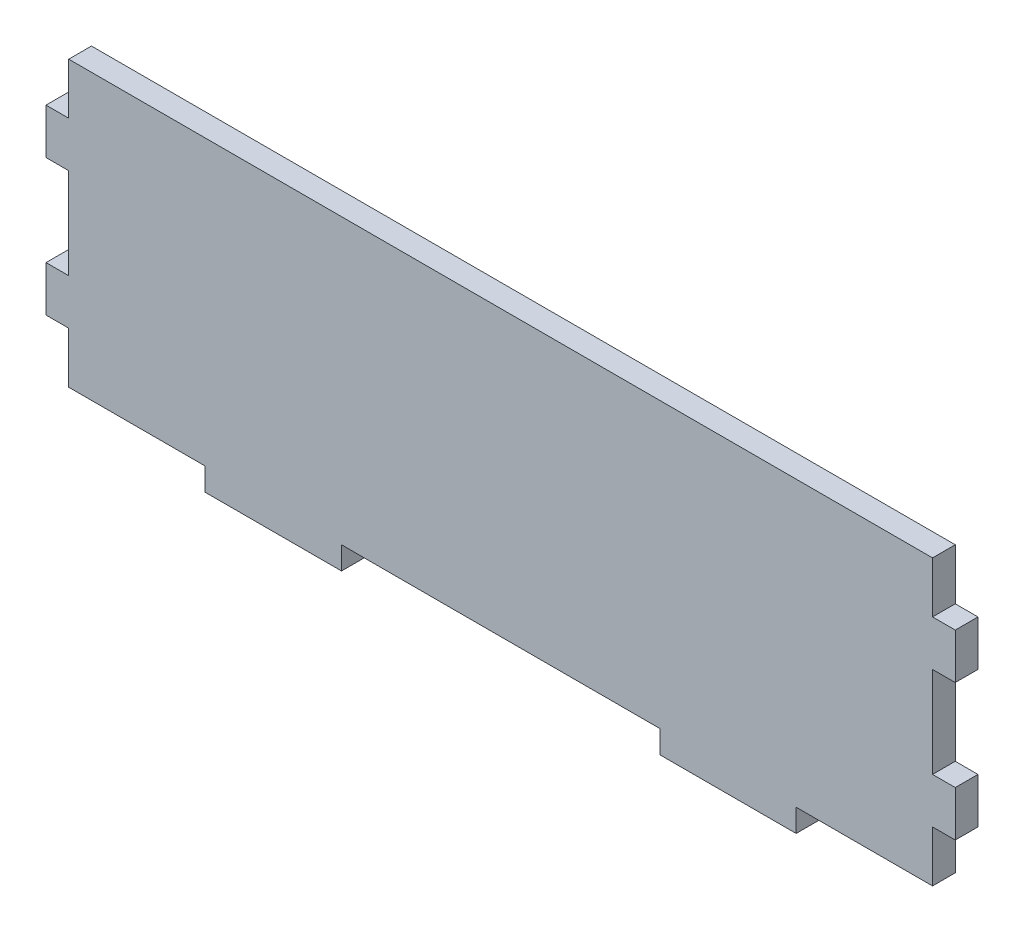
ISO-10303-21;
HEADER;
FILE_DESCRIPTION(('STEP AP214'),'2;1');
FILE_NAME('part.step','',(''),(''),'','','');
FILE_SCHEMA(('AUTOMOTIVE_DESIGN { 1 0 10303 214 1 1 1 1 }'));
ENDSEC;
DATA;
#1=APPLICATION_CONTEXT('core data for automotive mechanical design processes');
#2=APPLICATION_PROTOCOL_DEFINITION('international standard','automotive_design',2000,#1);
#3=PRODUCT_CONTEXT('',#1,'mechanical');
#4=PRODUCT('Part','Part','',(#3));
#5=PRODUCT_RELATED_PRODUCT_CATEGORY('part','',(#4));
#6=PRODUCT_DEFINITION_FORMATION('','',#4);
#7=PRODUCT_DEFINITION_CONTEXT('part definition',#1,'design');
#8=PRODUCT_DEFINITION('design','',#6,#7);
#9=PRODUCT_DEFINITION_SHAPE('','',#8);
#10=(LENGTH_UNIT() NAMED_UNIT(*) SI_UNIT(.MILLI.,.METRE.));
#11=(NAMED_UNIT(*) PLANE_ANGLE_UNIT() SI_UNIT($,.RADIAN.));
#12=(NAMED_UNIT(*) SI_UNIT($,.STERADIAN.) SOLID_ANGLE_UNIT());
#13=UNCERTAINTY_MEASURE_WITH_UNIT(LENGTH_MEASURE(1.E-05),#10,'distance_accuracy_value','');
#14=(GEOMETRIC_REPRESENTATION_CONTEXT(3) GLOBAL_UNCERTAINTY_ASSIGNED_CONTEXT((#13)) GLOBAL_UNIT_ASSIGNED_CONTEXT((#10,
#11,#12)) REPRESENTATION_CONTEXT('',''));
#15=CARTESIAN_POINT('',(0.,0.,0.));
#16=DIRECTION('',(0.,0.,1.));
#17=DIRECTION('',(1.,0.,0.));
#18=AXIS2_PLACEMENT_3D('',#15,#16,#17);
#19=CARTESIAN_POINT('',(96.52,-63.5,-5.08));
#20=DIRECTION('',(0.,-1.,0.));
#21=DIRECTION('',(0.,0.,-1.));
#22=AXIS2_PLACEMENT_3D('',#19,#20,#21);
#23=PLANE('',#22);
#24=DIRECTION('',(1.,0.,0.));
#25=VECTOR('',#24,1.);
#26=CARTESIAN_POINT('',(96.52,-63.5,0.));
#27=LINE('',#26,#25);
#28=CARTESIAN_POINT('',(-35.5600000000001,-63.5,0.));
#29=VERTEX_POINT('',#28);
#30=CARTESIAN_POINT('',(35.56,-63.5,0.));
#31=VERTEX_POINT('',#30);
#32=EDGE_CURVE('E401',#29,#31,#27,.T.);
#33=ORIENTED_EDGE('',*,*,#32,.F.);
#34=DIRECTION('',(0.,0.,1.));
#35=VECTOR('',#34,1.);
#36=CARTESIAN_POINT('',(-35.5600000000001,-63.5,-5.08));
#37=LINE('',#36,#35);
#38=CARTESIAN_POINT('',(-35.5600000000001,-63.5,-5.08));
#39=VERTEX_POINT('',#38);
#40=EDGE_CURVE('E50',#39,#29,#37,.T.);
#41=ORIENTED_EDGE('',*,*,#40,.F.);
#42=DIRECTION('',(1.,0.,0.));
#43=VECTOR('',#42,1.);
#44=CARTESIAN_POINT('',(96.52,-63.5,-5.08));
#45=LINE('',#44,#43);
#46=CARTESIAN_POINT('',(35.56,-63.5,-5.08));
#47=VERTEX_POINT('',#46);
#48=EDGE_CURVE('E387',#39,#47,#45,.T.);
#49=ORIENTED_EDGE('',*,*,#48,.T.);
#50=DIRECTION('',(0.,0.,-1.));
#51=VECTOR('',#50,1.);
#52=CARTESIAN_POINT('',(35.56,-63.5,0.));
#53=LINE('',#52,#51);
#54=EDGE_CURVE('E241',#31,#47,#53,.T.);
#55=ORIENTED_EDGE('',*,*,#54,.F.);
#56=EDGE_LOOP('',(#33,#41,#49,#55));
#57=FACE_BOUND('',#56,.T.);
#58=ADVANCED_FACE('F33',(#57),#23,.T.);
#59=CARTESIAN_POINT('',(-96.5200000000001,-63.5,-5.08));
#60=VERTEX_POINT('',#59);
#61=CARTESIAN_POINT('',(-66.0400000000001,-63.5,-5.08));
#62=VERTEX_POINT('',#61);
#63=EDGE_CURVE('E384',#60,#62,#45,.T.);
#64=ORIENTED_EDGE('',*,*,#63,.T.);
#65=DIRECTION('',(0.,0.,-1.));
#66=VECTOR('',#65,1.);
#67=CARTESIAN_POINT('',(-66.0400000000001,-63.5,-5.08));
#68=LINE('',#67,#66);
#69=CARTESIAN_POINT('',(-66.0400000000001,-63.5,0.));
#70=VERTEX_POINT('',#69);
#71=EDGE_CURVE('E238',#70,#62,#68,.T.);
#72=ORIENTED_EDGE('',*,*,#71,.F.);
#73=CARTESIAN_POINT('',(-96.5200000000001,-63.5,0.));
#74=VERTEX_POINT('',#73);
#75=EDGE_CURVE('E400',#74,#70,#27,.T.);
#76=ORIENTED_EDGE('',*,*,#75,.F.);
#77=DIRECTION('',(0.,0.,1.));
#78=VECTOR('',#77,1.);
#79=CARTESIAN_POINT('',(-96.5200000000001,-63.5,-5.08));
#80=LINE('',#79,#78);
#81=EDGE_CURVE('E42',#60,#74,#80,.T.);
#82=ORIENTED_EDGE('',*,*,#81,.F.);
#83=EDGE_LOOP('',(#64,#72,#76,#82));
#84=FACE_BOUND('',#83,.T.);
#85=ADVANCED_FACE('F474',(#84),#23,.T.);
#86=CARTESIAN_POINT('',(-96.5200000000001,-63.5,-5.08));
#87=DIRECTION('',(-1.,0.,0.));
#88=DIRECTION('',(0.,0.,1.));
#89=AXIS2_PLACEMENT_3D('',#86,#87,#88);
#90=PLANE('',#89);
#91=DIRECTION('',(0.,-1.,0.));
#92=VECTOR('',#91,1.);
#93=CARTESIAN_POINT('',(-96.5200000000001,-63.5,0.));
#94=LINE('',#93,#92);
#95=CARTESIAN_POINT('',(-96.5200000000001,-21.59,0.));
#96=VERTEX_POINT('',#95);
#97=CARTESIAN_POINT('',(-96.5200000000001,-41.91,0.));
#98=VERTEX_POINT('',#97);
#99=EDGE_CURVE('E399',#96,#98,#94,.T.);
#100=ORIENTED_EDGE('',*,*,#99,.F.);
#101=DIRECTION('',(0.,0.,1.));
#102=VECTOR('',#101,1.);
#103=CARTESIAN_POINT('',(-96.5200000000001,-21.59,-5.08));
#104=LINE('',#103,#102);
#105=CARTESIAN_POINT('',(-96.5200000000001,-21.59,-5.08));
#106=VERTEX_POINT('',#105);
#107=EDGE_CURVE('E278',#106,#96,#104,.T.);
#108=ORIENTED_EDGE('',*,*,#107,.F.);
#109=DIRECTION('',(0.,-1.,0.));
#110=VECTOR('',#109,1.);
#111=CARTESIAN_POINT('',(-96.5200000000001,-63.5,-5.08));
#112=LINE('',#111,#110);
#113=CARTESIAN_POINT('',(-96.5200000000001,-41.91,-5.08));
#114=VERTEX_POINT('',#113);
#115=EDGE_CURVE('E383',#106,#114,#112,.T.);
#116=ORIENTED_EDGE('',*,*,#115,.T.);
#117=DIRECTION('',(0.,0.,1.));
#118=VECTOR('',#117,1.);
#119=CARTESIAN_POINT('',(-96.5200000000001,-41.91,-5.08));
#120=LINE('',#119,#118);
#121=EDGE_CURVE('E292',#114,#98,#120,.T.);
#122=ORIENTED_EDGE('',*,*,#121,.T.);
#123=EDGE_LOOP('',(#100,#108,#116,#122));
#124=FACE_BOUND('',#123,.T.);
#125=ADVANCED_FACE('F459',(#124),#90,.T.);
#126=DIRECTION('',(0.,0.,1.));
#127=VECTOR('',#126,1.);
#128=CARTESIAN_POINT('',(-96.5200000000001,-11.43,-5.08));
#129=LINE('',#128,#127);
#130=CARTESIAN_POINT('',(-96.5200000000001,-11.43,-5.08));
#131=VERTEX_POINT('',#130);
#132=CARTESIAN_POINT('',(-96.5200000000001,-11.43,0.));
#133=VERTEX_POINT('',#132);
#134=EDGE_CURVE('E271',#131,#133,#129,.T.);
#135=ORIENTED_EDGE('',*,*,#134,.T.);
#136=CARTESIAN_POINT('',(-96.5200000000001,0.,0.));
#137=VERTEX_POINT('',#136);
#138=EDGE_CURVE('E395',#137,#133,#94,.T.);
#139=ORIENTED_EDGE('',*,*,#138,.F.);
#140=DIRECTION('',(0.,0.,1.));
#141=VECTOR('',#140,1.);
#142=CARTESIAN_POINT('',(-96.5200000000001,0.,-5.08));
#143=LINE('',#142,#141);
#144=CARTESIAN_POINT('',(-96.5200000000001,0.,-5.08));
#145=VERTEX_POINT('',#144);
#146=EDGE_CURVE('E404',#145,#137,#143,.T.);
#147=ORIENTED_EDGE('',*,*,#146,.F.);
#148=EDGE_CURVE('E379',#145,#131,#112,.T.);
#149=ORIENTED_EDGE('',*,*,#148,.T.);
#150=EDGE_LOOP('',(#135,#139,#147,#149));
#151=FACE_BOUND('',#150,.T.);
#152=ADVANCED_FACE('F444',(#151),#90,.T.);
#153=CARTESIAN_POINT('',(96.52,-63.5,-5.08));
#154=DIRECTION('',(1.,0.,0.));
#155=DIRECTION('',(0.,0.,-1.));
#156=AXIS2_PLACEMENT_3D('',#153,#154,#155);
#157=PLANE('',#156);
#158=DIRECTION('',(0.,1.,0.));
#159=VECTOR('',#158,1.);
#160=CARTESIAN_POINT('',(96.52,-63.5,-5.08));
#161=LINE('',#160,#159);
#162=CARTESIAN_POINT('',(96.52,-41.91,-5.08));
#163=VERTEX_POINT('',#162);
#164=CARTESIAN_POINT('',(96.52,-21.59,-5.08));
#165=VERTEX_POINT('',#164);
#166=EDGE_CURVE('E374',#163,#165,#161,.T.);
#167=ORIENTED_EDGE('',*,*,#166,.T.);
#168=DIRECTION('',(0.,0.,1.));
#169=VECTOR('',#168,1.);
#170=CARTESIAN_POINT('',(96.52,-21.59,-5.08));
#171=LINE('',#170,#169);
#172=CARTESIAN_POINT('',(96.52,-21.59,0.));
#173=VERTEX_POINT('',#172);
#174=EDGE_CURVE('E317',#165,#173,#171,.T.);
#175=ORIENTED_EDGE('',*,*,#174,.T.);
#176=DIRECTION('',(0.,1.,0.));
#177=VECTOR('',#176,1.);
#178=CARTESIAN_POINT('',(96.52,-63.5,0.));
#179=LINE('',#178,#177);
#180=CARTESIAN_POINT('',(96.52,-41.91,0.));
#181=VERTEX_POINT('',#180);
#182=EDGE_CURVE('E391',#181,#173,#179,.T.);
#183=ORIENTED_EDGE('',*,*,#182,.F.);
#184=DIRECTION('',(0.,0.,1.));
#185=VECTOR('',#184,1.);
#186=CARTESIAN_POINT('',(96.52,-41.91,-5.08));
#187=LINE('',#186,#185);
#188=EDGE_CURVE('E354',#163,#181,#187,.T.);
#189=ORIENTED_EDGE('',*,*,#188,.F.);
#190=EDGE_LOOP('',(#167,#175,#183,#189));
#191=FACE_BOUND('',#190,.T.);
#192=ADVANCED_FACE('F425',(#191),#157,.T.);
#193=CARTESIAN_POINT('',(96.52,-63.5,-5.08));
#194=VERTEX_POINT('',#193);
#195=CARTESIAN_POINT('',(96.52,-52.07,-5.08));
#196=VERTEX_POINT('',#195);
#197=EDGE_CURVE('E370',#194,#196,#161,.T.);
#198=ORIENTED_EDGE('',*,*,#197,.T.);
#199=DIRECTION('',(0.,0.,1.));
#200=VECTOR('',#199,1.);
#201=CARTESIAN_POINT('',(96.52,-52.07,-5.08));
#202=LINE('',#201,#200);
#203=CARTESIAN_POINT('',(96.52,-52.07,0.));
#204=VERTEX_POINT('',#203);
#205=EDGE_CURVE('E366',#196,#204,#202,.T.);
#206=ORIENTED_EDGE('',*,*,#205,.T.);
#207=CARTESIAN_POINT('',(96.52,-63.5,0.));
#208=VERTEX_POINT('',#207);
#209=EDGE_CURVE('E388',#208,#204,#179,.T.);
#210=ORIENTED_EDGE('',*,*,#209,.F.);
#211=DIRECTION('',(0.,0.,1.));
#212=VECTOR('',#211,1.);
#213=CARTESIAN_POINT('',(96.52,-63.5,-5.08));
#214=LINE('',#213,#212);
#215=EDGE_CURVE('E11',#194,#208,#214,.T.);
#216=ORIENTED_EDGE('',*,*,#215,.F.);
#217=EDGE_LOOP('',(#198,#206,#210,#216));
#218=FACE_BOUND('',#217,.T.);
#219=ADVANCED_FACE('F510',(#218),#157,.T.);
#220=DIRECTION('',(0.,0.,1.));
#221=VECTOR('',#220,1.);
#222=CARTESIAN_POINT('',(96.52,-11.43,-5.08));
#223=LINE('',#222,#221);
#224=CARTESIAN_POINT('',(96.52,-11.43,-5.08));
#225=VERTEX_POINT('',#224);
#226=CARTESIAN_POINT('',(96.52,-11.43,0.));
#227=VERTEX_POINT('',#226);
#228=EDGE_CURVE('E325',#225,#227,#223,.T.);
#229=ORIENTED_EDGE('',*,*,#228,.F.);
#230=CARTESIAN_POINT('',(96.52,0.,-5.08));
#231=VERTEX_POINT('',#230);
#232=EDGE_CURVE('E375',#225,#231,#161,.T.);
#233=ORIENTED_EDGE('',*,*,#232,.T.);
#234=DIRECTION('',(0.,0.,1.));
#235=VECTOR('',#234,1.);
#236=CARTESIAN_POINT('',(96.52,0.,-5.08));
#237=LINE('',#236,#235);
#238=CARTESIAN_POINT('',(96.52,0.,0.));
#239=VERTEX_POINT('',#238);
#240=EDGE_CURVE('E37',#231,#239,#237,.T.);
#241=ORIENTED_EDGE('',*,*,#240,.T.);
#242=EDGE_CURVE('E363',#227,#239,#179,.T.);
#243=ORIENTED_EDGE('',*,*,#242,.F.);
#244=EDGE_LOOP('',(#229,#233,#241,#243));
#245=FACE_BOUND('',#244,.T.);
#246=ADVANCED_FACE('F35',(#245),#157,.T.);
#247=DIRECTION('',(0.,0.,1.));
#248=VECTOR('',#247,1.);
#249=CARTESIAN_POINT('',(66.04,-63.5,0.));
#250=LINE('',#249,#248);
#251=CARTESIAN_POINT('',(66.04,-63.5,-5.08));
#252=VERTEX_POINT('',#251);
#253=CARTESIAN_POINT('',(66.04,-63.5,0.));
#254=VERTEX_POINT('',#253);
#255=EDGE_CURVE('E58',#252,#254,#250,.T.);
#256=ORIENTED_EDGE('',*,*,#255,.F.);
#257=EDGE_CURVE('E382',#252,#194,#45,.T.);
#258=ORIENTED_EDGE('',*,*,#257,.T.);
#259=ORIENTED_EDGE('',*,*,#215,.T.);
#260=EDGE_CURVE('E398',#254,#208,#27,.T.);
#261=ORIENTED_EDGE('',*,*,#260,.F.);
#262=EDGE_LOOP('',(#256,#258,#259,#261));
#263=FACE_BOUND('',#262,.T.);
#264=ADVANCED_FACE('F497',(#263),#23,.T.);
#265=DIRECTION('',(0.,0.,1.));
#266=VECTOR('',#265,1.);
#267=CARTESIAN_POINT('',(-96.5200000000001,-52.07,-5.08));
#268=LINE('',#267,#266);
#269=CARTESIAN_POINT('',(-96.5200000000001,-52.07,-5.08));
#270=VERTEX_POINT('',#269);
#271=CARTESIAN_POINT('',(-96.5200000000001,-52.07,0.));
#272=VERTEX_POINT('',#271);
#273=EDGE_CURVE('E304',#270,#272,#268,.T.);
#274=ORIENTED_EDGE('',*,*,#273,.F.);
#275=EDGE_CURVE('E378',#270,#60,#112,.T.);
#276=ORIENTED_EDGE('',*,*,#275,.T.);
#277=ORIENTED_EDGE('',*,*,#81,.T.);
#278=EDGE_CURVE('E394',#272,#74,#94,.T.);
#279=ORIENTED_EDGE('',*,*,#278,.F.);
#280=EDGE_LOOP('',(#274,#276,#277,#279));
#281=FACE_BOUND('',#280,.T.);
#282=ADVANCED_FACE('F469',(#281),#90,.T.);
#283=CARTESIAN_POINT('',(96.52,0.,-5.08));
#284=DIRECTION('',(0.,1.,0.));
#285=DIRECTION('',(0.,0.,1.));
#286=AXIS2_PLACEMENT_3D('',#283,#284,#285);
#287=PLANE('',#286);
#288=DIRECTION('',(-1.,0.,0.));
#289=VECTOR('',#288,1.);
#290=CARTESIAN_POINT('',(96.52,0.,0.));
#291=LINE('',#290,#289);
#292=EDGE_CURVE('E390',#239,#137,#291,.T.);
#293=ORIENTED_EDGE('',*,*,#292,.F.);
#294=ORIENTED_EDGE('',*,*,#240,.F.);
#295=DIRECTION('',(-1.,0.,0.));
#296=VECTOR('',#295,1.);
#297=CARTESIAN_POINT('',(96.52,0.,-5.08));
#298=LINE('',#297,#296);
#299=EDGE_CURVE('E373',#231,#145,#298,.T.);
#300=ORIENTED_EDGE('',*,*,#299,.T.);
#301=ORIENTED_EDGE('',*,*,#146,.T.);
#302=EDGE_LOOP('',(#293,#294,#300,#301));
#303=FACE_BOUND('',#302,.T.);
#304=ADVANCED_FACE('F415',(#303),#287,.T.);
#305=CARTESIAN_POINT('',(0.,0.,-5.08));
#306=DIRECTION('',(0.,0.,1.));
#307=DIRECTION('',(1.,0.,0.));
#308=AXIS2_PLACEMENT_3D('',#305,#306,#307);
#309=PLANE('',#308);
#310=ORIENTED_EDGE('',*,*,#197,.F.);
#311=ORIENTED_EDGE('',*,*,#257,.F.);
#312=DIRECTION('',(0.,1.,0.));
#313=VECTOR('',#312,1.);
#314=CARTESIAN_POINT('',(66.04,-68.58,-5.08));
#315=LINE('',#314,#313);
#316=CARTESIAN_POINT('',(66.04,-68.58,-5.08));
#317=VERTEX_POINT('',#316);
#318=EDGE_CURVE('E265',#317,#252,#315,.T.);
#319=ORIENTED_EDGE('',*,*,#318,.F.);
#320=DIRECTION('',(1.,0.,0.));
#321=VECTOR('',#320,1.);
#322=CARTESIAN_POINT('',(35.56,-68.58,-5.08));
#323=LINE('',#322,#321);
#324=CARTESIAN_POINT('',(35.56,-68.58,-5.08));
#325=VERTEX_POINT('',#324);
#326=EDGE_CURVE('E252',#325,#317,#323,.T.);
#327=ORIENTED_EDGE('',*,*,#326,.F.);
#328=DIRECTION('',(0.,1.,0.));
#329=VECTOR('',#328,1.);
#330=CARTESIAN_POINT('',(35.56,-68.58,-5.08));
#331=LINE('',#330,#329);
#332=EDGE_CURVE('E268',#325,#47,#331,.T.);
#333=ORIENTED_EDGE('',*,*,#332,.T.);
#334=ORIENTED_EDGE('',*,*,#48,.F.);
#335=DIRECTION('',(0.,1.,0.));
#336=VECTOR('',#335,1.);
#337=CARTESIAN_POINT('',(-35.5600000000001,-68.58,-5.08));
#338=LINE('',#337,#336);
#339=CARTESIAN_POINT('',(-35.5600000000001,-68.58,-5.08));
#340=VERTEX_POINT('',#339);
#341=EDGE_CURVE('E482',#340,#39,#338,.T.);
#342=ORIENTED_EDGE('',*,*,#341,.F.);
#343=DIRECTION('',(1.,0.,0.));
#344=VECTOR('',#343,1.);
#345=CARTESIAN_POINT('',(-35.5600000000001,-68.58,-5.08));
#346=LINE('',#345,#344);
#347=CARTESIAN_POINT('',(-66.0400000000001,-68.58,-5.08));
#348=VERTEX_POINT('',#347);
#349=EDGE_CURVE('E236',#348,#340,#346,.T.);
#350=ORIENTED_EDGE('',*,*,#349,.F.);
#351=DIRECTION('',(0.,1.,0.));
#352=VECTOR('',#351,1.);
#353=CARTESIAN_POINT('',(-66.0400000000001,-68.58,-5.08));
#354=LINE('',#353,#352);
#355=EDGE_CURVE('E245',#348,#62,#354,.T.);
#356=ORIENTED_EDGE('',*,*,#355,.T.);
#357=ORIENTED_EDGE('',*,*,#63,.F.);
#358=ORIENTED_EDGE('',*,*,#275,.F.);
#359=DIRECTION('',(-1.,0.,0.));
#360=VECTOR('',#359,1.);
#361=CARTESIAN_POINT('',(-96.5200000000001,-52.07,-5.08));
#362=LINE('',#361,#360);
#363=CARTESIAN_POINT('',(-101.6,-52.07,-5.08));
#364=VERTEX_POINT('',#363);
#365=EDGE_CURVE('E300',#270,#364,#362,.T.);
#366=ORIENTED_EDGE('',*,*,#365,.T.);
#367=DIRECTION('',(0.,1.,0.));
#368=VECTOR('',#367,1.);
#369=CARTESIAN_POINT('',(-101.6,-52.07,-5.08));
#370=LINE('',#369,#368);
#371=CARTESIAN_POINT('',(-101.6,-41.91,-5.08));
#372=VERTEX_POINT('',#371);
#373=EDGE_CURVE('E319',#364,#372,#370,.T.);
#374=ORIENTED_EDGE('',*,*,#373,.T.);
#375=DIRECTION('',(-1.,0.,0.));
#376=VECTOR('',#375,1.);
#377=CARTESIAN_POINT('',(-96.5200000000001,-41.91,-5.08));
#378=LINE('',#377,#376);
#379=EDGE_CURVE('E311',#114,#372,#378,.T.);
#380=ORIENTED_EDGE('',*,*,#379,.F.);
#381=ORIENTED_EDGE('',*,*,#115,.F.);
#382=DIRECTION('',(-1.,0.,0.));
#383=VECTOR('',#382,1.);
#384=CARTESIAN_POINT('',(-96.5200000000001,-21.59,-5.08));
#385=LINE('',#384,#383);
#386=CARTESIAN_POINT('',(-101.6,-21.59,-5.08));
#387=VERTEX_POINT('',#386);
#388=EDGE_CURVE('E274',#106,#387,#385,.T.);
#389=ORIENTED_EDGE('',*,*,#388,.T.);
#390=DIRECTION('',(0.,1.,0.));
#391=VECTOR('',#390,1.);
#392=CARTESIAN_POINT('',(-101.6,-21.59,-5.08));
#393=LINE('',#392,#391);
#394=CARTESIAN_POINT('',(-101.6,-11.43,-5.08));
#395=VERTEX_POINT('',#394);
#396=EDGE_CURVE('E294',#387,#395,#393,.T.);
#397=ORIENTED_EDGE('',*,*,#396,.T.);
#398=DIRECTION('',(-1.,0.,0.));
#399=VECTOR('',#398,1.);
#400=CARTESIAN_POINT('',(-96.5200000000001,-11.43,-5.08));
#401=LINE('',#400,#399);
#402=EDGE_CURVE('E286',#131,#395,#401,.T.);
#403=ORIENTED_EDGE('',*,*,#402,.F.);
#404=ORIENTED_EDGE('',*,*,#148,.F.);
#405=ORIENTED_EDGE('',*,*,#299,.F.);
#406=ORIENTED_EDGE('',*,*,#232,.F.);
#407=DIRECTION('',(-1.,0.,0.));
#408=VECTOR('',#407,1.);
#409=CARTESIAN_POINT('',(101.6,-11.43,-5.08));
#410=LINE('',#409,#408);
#411=CARTESIAN_POINT('',(101.6,-11.43,-5.08));
#412=VERTEX_POINT('',#411);
#413=EDGE_CURVE('E343',#412,#225,#410,.T.);
#414=ORIENTED_EDGE('',*,*,#413,.F.);
#415=DIRECTION('',(0.,-1.,0.));
#416=VECTOR('',#415,1.);
#417=CARTESIAN_POINT('',(101.6,-11.43,-5.08));
#418=LINE('',#417,#416);
#419=CARTESIAN_POINT('',(101.6,-21.59,-5.08));
#420=VERTEX_POINT('',#419);
#421=EDGE_CURVE('E333',#412,#420,#418,.T.);
#422=ORIENTED_EDGE('',*,*,#421,.T.);
#423=DIRECTION('',(-1.,0.,0.));
#424=VECTOR('',#423,1.);
#425=CARTESIAN_POINT('',(101.6,-21.59,-5.08));
#426=LINE('',#425,#424);
#427=EDGE_CURVE('E337',#420,#165,#426,.T.);
#428=ORIENTED_EDGE('',*,*,#427,.T.);
#429=ORIENTED_EDGE('',*,*,#166,.F.);
#430=DIRECTION('',(-1.,0.,0.));
#431=VECTOR('',#430,1.);
#432=CARTESIAN_POINT('',(101.6,-41.91,-5.08));
#433=LINE('',#432,#431);
#434=CARTESIAN_POINT('',(101.6,-41.91,-5.08));
#435=VERTEX_POINT('',#434);
#436=EDGE_CURVE('E346',#435,#163,#433,.T.);
#437=ORIENTED_EDGE('',*,*,#436,.F.);
#438=DIRECTION('',(0.,1.,0.));
#439=VECTOR('',#438,1.);
#440=CARTESIAN_POINT('',(101.6,-52.07,-5.08));
#441=LINE('',#440,#439);
#442=CARTESIAN_POINT('',(101.6,-52.07,-5.08));
#443=VERTEX_POINT('',#442);
#444=EDGE_CURVE('E351',#443,#435,#441,.T.);
#445=ORIENTED_EDGE('',*,*,#444,.F.);
#446=DIRECTION('',(-1.,0.,0.));
#447=VECTOR('',#446,1.);
#448=CARTESIAN_POINT('',(101.6,-52.07,-5.08));
#449=LINE('',#448,#447);
#450=EDGE_CURVE('E348',#443,#196,#449,.T.);
#451=ORIENTED_EDGE('',*,*,#450,.T.);
#452=EDGE_LOOP('',(#310,#311,#319,#327,#333,#334,#342,#350,#356,#357,#358,#366,#374,#380,#381,
#389,#397,#403,#404,#405,#406,#414,#422,#428,#429,#437,#445,#451));
#453=FACE_BOUND('',#452,.T.);
#454=ADVANCED_FACE('F440',(#453),#309,.F.);
#455=CARTESIAN_POINT('',(0.,0.,0.));
#456=DIRECTION('',(0.,0.,1.));
#457=DIRECTION('',(1.,0.,0.));
#458=AXIS2_PLACEMENT_3D('',#455,#456,#457);
#459=PLANE('',#458);
#460=ORIENTED_EDGE('',*,*,#209,.T.);
#461=DIRECTION('',(-1.,0.,0.));
#462=VECTOR('',#461,1.);
#463=CARTESIAN_POINT('',(101.6,-52.07,0.));
#464=LINE('',#463,#462);
#465=CARTESIAN_POINT('',(101.6,-52.07,0.));
#466=VERTEX_POINT('',#465);
#467=EDGE_CURVE('E357',#466,#204,#464,.T.);
#468=ORIENTED_EDGE('',*,*,#467,.F.);
#469=DIRECTION('',(0.,1.,0.));
#470=VECTOR('',#469,1.);
#471=CARTESIAN_POINT('',(101.6,-52.07,0.));
#472=LINE('',#471,#470);
#473=CARTESIAN_POINT('',(101.6,-41.91,0.));
#474=VERTEX_POINT('',#473);
#475=EDGE_CURVE('E349',#466,#474,#472,.T.);
#476=ORIENTED_EDGE('',*,*,#475,.T.);
#477=DIRECTION('',(-1.,0.,0.));
#478=VECTOR('',#477,1.);
#479=CARTESIAN_POINT('',(101.6,-41.91,0.));
#480=LINE('',#479,#478);
#481=EDGE_CURVE('E341',#474,#181,#480,.T.);
#482=ORIENTED_EDGE('',*,*,#481,.T.);
#483=ORIENTED_EDGE('',*,*,#182,.T.);
#484=DIRECTION('',(-1.,0.,0.));
#485=VECTOR('',#484,1.);
#486=CARTESIAN_POINT('',(101.6,-21.59,0.));
#487=LINE('',#486,#485);
#488=CARTESIAN_POINT('',(101.6,-21.59,0.));
#489=VERTEX_POINT('',#488);
#490=EDGE_CURVE('E339',#489,#173,#487,.T.);
#491=ORIENTED_EDGE('',*,*,#490,.F.);
#492=DIRECTION('',(0.,-1.,0.));
#493=VECTOR('',#492,1.);
#494=CARTESIAN_POINT('',(101.6,-11.43,0.));
#495=LINE('',#494,#493);
#496=CARTESIAN_POINT('',(101.6,-11.43,0.));
#497=VERTEX_POINT('',#496);
#498=EDGE_CURVE('E334',#497,#489,#495,.T.);
#499=ORIENTED_EDGE('',*,*,#498,.F.);
#500=DIRECTION('',(-1.,0.,0.));
#501=VECTOR('',#500,1.);
#502=CARTESIAN_POINT('',(101.6,-11.43,0.));
#503=LINE('',#502,#501);
#504=EDGE_CURVE('E336',#497,#227,#503,.T.);
#505=ORIENTED_EDGE('',*,*,#504,.T.);
#506=ORIENTED_EDGE('',*,*,#242,.T.);
#507=ORIENTED_EDGE('',*,*,#292,.T.);
#508=ORIENTED_EDGE('',*,*,#138,.T.);
#509=DIRECTION('',(-1.,0.,0.));
#510=VECTOR('',#509,1.);
#511=CARTESIAN_POINT('',(-96.5200000000001,-11.43,0.));
#512=LINE('',#511,#510);
#513=CARTESIAN_POINT('',(-101.6,-11.43,0.));
#514=VERTEX_POINT('',#513);
#515=EDGE_CURVE('E289',#133,#514,#512,.T.);
#516=ORIENTED_EDGE('',*,*,#515,.T.);
#517=DIRECTION('',(0.,1.,0.));
#518=VECTOR('',#517,1.);
#519=CARTESIAN_POINT('',(-101.6,-21.59,0.));
#520=LINE('',#519,#518);
#521=CARTESIAN_POINT('',(-101.6,-21.59,0.));
#522=VERTEX_POINT('',#521);
#523=EDGE_CURVE('E285',#522,#514,#520,.T.);
#524=ORIENTED_EDGE('',*,*,#523,.F.);
#525=DIRECTION('',(-1.,0.,0.));
#526=VECTOR('',#525,1.);
#527=CARTESIAN_POINT('',(-96.5200000000001,-21.59,0.));
#528=LINE('',#527,#526);
#529=EDGE_CURVE('E283',#96,#522,#528,.T.);
#530=ORIENTED_EDGE('',*,*,#529,.F.);
#531=ORIENTED_EDGE('',*,*,#99,.T.);
#532=DIRECTION('',(-1.,0.,0.));
#533=VECTOR('',#532,1.);
#534=CARTESIAN_POINT('',(-96.5200000000001,-41.91,0.));
#535=LINE('',#534,#533);
#536=CARTESIAN_POINT('',(-101.6,-41.91,0.));
#537=VERTEX_POINT('',#536);
#538=EDGE_CURVE('E314',#98,#537,#535,.T.);
#539=ORIENTED_EDGE('',*,*,#538,.T.);
#540=DIRECTION('',(0.,1.,0.));
#541=VECTOR('',#540,1.);
#542=CARTESIAN_POINT('',(-101.6,-52.07,0.));
#543=LINE('',#542,#541);
#544=CARTESIAN_POINT('',(-101.6,-52.07,0.));
#545=VERTEX_POINT('',#544);
#546=EDGE_CURVE('E310',#545,#537,#543,.T.);
#547=ORIENTED_EDGE('',*,*,#546,.F.);
#548=DIRECTION('',(-1.,0.,0.));
#549=VECTOR('',#548,1.);
#550=CARTESIAN_POINT('',(-96.5200000000001,-52.07,0.));
#551=LINE('',#550,#549);
#552=EDGE_CURVE('E308',#272,#545,#551,.T.);
#553=ORIENTED_EDGE('',*,*,#552,.F.);
#554=ORIENTED_EDGE('',*,*,#278,.T.);
#555=ORIENTED_EDGE('',*,*,#75,.T.);
#556=DIRECTION('',(0.,1.,0.));
#557=VECTOR('',#556,1.);
#558=CARTESIAN_POINT('',(-66.0400000000001,-68.58,0.));
#559=LINE('',#558,#557);
#560=CARTESIAN_POINT('',(-66.0400000000001,-68.58,0.));
#561=VERTEX_POINT('',#560);
#562=EDGE_CURVE('E227',#561,#70,#559,.T.);
#563=ORIENTED_EDGE('',*,*,#562,.F.);
#564=DIRECTION('',(-1.,0.,0.));
#565=VECTOR('',#564,1.);
#566=CARTESIAN_POINT('',(-35.5600000000001,-68.58,0.));
#567=LINE('',#566,#565);
#568=CARTESIAN_POINT('',(-35.5600000000001,-68.58,0.));
#569=VERTEX_POINT('',#568);
#570=EDGE_CURVE('E220',#569,#561,#567,.T.);
#571=ORIENTED_EDGE('',*,*,#570,.F.);
#572=DIRECTION('',(0.,1.,0.));
#573=VECTOR('',#572,1.);
#574=CARTESIAN_POINT('',(-35.5600000000001,-68.58,0.));
#575=LINE('',#574,#573);
#576=EDGE_CURVE('E224',#569,#29,#575,.T.);
#577=ORIENTED_EDGE('',*,*,#576,.T.);
#578=ORIENTED_EDGE('',*,*,#32,.T.);
#579=DIRECTION('',(0.,1.,0.));
#580=VECTOR('',#579,1.);
#581=CARTESIAN_POINT('',(35.56,-68.58,0.));
#582=LINE('',#581,#580);
#583=CARTESIAN_POINT('',(35.56,-68.58,0.));
#584=VERTEX_POINT('',#583);
#585=EDGE_CURVE('E257',#584,#31,#582,.T.);
#586=ORIENTED_EDGE('',*,*,#585,.F.);
#587=DIRECTION('',(-1.,0.,0.));
#588=VECTOR('',#587,1.);
#589=CARTESIAN_POINT('',(35.56,-68.58,0.));
#590=LINE('',#589,#588);
#591=CARTESIAN_POINT('',(66.04,-68.58,0.));
#592=VERTEX_POINT('',#591);
#593=EDGE_CURVE('E256',#592,#584,#590,.T.);
#594=ORIENTED_EDGE('',*,*,#593,.F.);
#595=DIRECTION('',(0.,1.,0.));
#596=VECTOR('',#595,1.);
#597=CARTESIAN_POINT('',(66.04,-68.58,0.));
#598=LINE('',#597,#596);
#599=EDGE_CURVE('E262',#592,#254,#598,.T.);
#600=ORIENTED_EDGE('',*,*,#599,.T.);
#601=ORIENTED_EDGE('',*,*,#260,.T.);
#602=EDGE_LOOP('',(#460,#468,#476,#482,#483,#491,#499,#505,#506,#507,#508,#516,#524,#530,#531,
#539,#547,#553,#554,#555,#563,#571,#577,#578,#586,#594,#600,#601));
#603=FACE_BOUND('',#602,.T.);
#604=ADVANCED_FACE('F223',(#603),#459,.T.);
#605=CARTESIAN_POINT('',(101.6,-41.91,-5.08));
#606=DIRECTION('',(0.,1.,0.));
#607=DIRECTION('',(0.,0.,1.));
#608=AXIS2_PLACEMENT_3D('',#605,#606,#607);
#609=PLANE('',#608);
#610=ORIENTED_EDGE('',*,*,#481,.F.);
#611=DIRECTION('',(0.,0.,1.));
#612=VECTOR('',#611,1.);
#613=CARTESIAN_POINT('',(101.6,-41.91,-5.08));
#614=LINE('',#613,#612);
#615=EDGE_CURVE('E361',#435,#474,#614,.T.);
#616=ORIENTED_EDGE('',*,*,#615,.F.);
#617=ORIENTED_EDGE('',*,*,#436,.T.);
#618=ORIENTED_EDGE('',*,*,#188,.T.);
#619=EDGE_LOOP('',(#610,#616,#617,#618));
#620=FACE_BOUND('',#619,.T.);
#621=ADVANCED_FACE('F531',(#620),#609,.T.);
#622=CARTESIAN_POINT('',(101.6,-52.07,-5.08));
#623=DIRECTION('',(1.,0.,0.));
#624=DIRECTION('',(0.,0.,-1.));
#625=AXIS2_PLACEMENT_3D('',#622,#623,#624);
#626=PLANE('',#625);
#627=ORIENTED_EDGE('',*,*,#475,.F.);
#628=DIRECTION('',(0.,0.,1.));
#629=VECTOR('',#628,1.);
#630=CARTESIAN_POINT('',(101.6,-52.07,-5.08));
#631=LINE('',#630,#629);
#632=EDGE_CURVE('E364',#443,#466,#631,.T.);
#633=ORIENTED_EDGE('',*,*,#632,.F.);
#634=ORIENTED_EDGE('',*,*,#444,.T.);
#635=ORIENTED_EDGE('',*,*,#615,.T.);
#636=EDGE_LOOP('',(#627,#633,#634,#635));
#637=FACE_BOUND('',#636,.T.);
#638=ADVANCED_FACE('F535',(#637),#626,.T.);
#639=CARTESIAN_POINT('',(101.6,-52.07,-5.08));
#640=DIRECTION('',(0.,1.,0.));
#641=DIRECTION('',(0.,0.,1.));
#642=AXIS2_PLACEMENT_3D('',#639,#640,#641);
#643=PLANE('',#642);
#644=ORIENTED_EDGE('',*,*,#467,.T.);
#645=ORIENTED_EDGE('',*,*,#205,.F.);
#646=ORIENTED_EDGE('',*,*,#450,.F.);
#647=ORIENTED_EDGE('',*,*,#632,.T.);
#648=EDGE_LOOP('',(#644,#645,#646,#647));
#649=FACE_BOUND('',#648,.T.);
#650=ADVANCED_FACE('F537',(#649),#643,.F.);
#651=CARTESIAN_POINT('',(101.6,-21.59,-5.08));
#652=DIRECTION('',(0.,1.,0.));
#653=DIRECTION('',(0.,0.,1.));
#654=AXIS2_PLACEMENT_3D('',#651,#652,#653);
#655=PLANE('',#654);
#656=ORIENTED_EDGE('',*,*,#490,.T.);
#657=ORIENTED_EDGE('',*,*,#174,.F.);
#658=ORIENTED_EDGE('',*,*,#427,.F.);
#659=DIRECTION('',(0.,0.,1.));
#660=VECTOR('',#659,1.);
#661=CARTESIAN_POINT('',(101.6,-21.59,-5.08));
#662=LINE('',#661,#660);
#663=EDGE_CURVE('E330',#420,#489,#662,.T.);
#664=ORIENTED_EDGE('',*,*,#663,.T.);
#665=EDGE_LOOP('',(#656,#657,#658,#664));
#666=FACE_BOUND('',#665,.T.);
#667=ADVANCED_FACE('F430',(#666),#655,.F.);
#668=CARTESIAN_POINT('',(101.6,-11.43,-5.08));
#669=DIRECTION('',(0.,1.,0.));
#670=DIRECTION('',(0.,0.,1.));
#671=AXIS2_PLACEMENT_3D('',#668,#669,#670);
#672=PLANE('',#671);
#673=ORIENTED_EDGE('',*,*,#504,.F.);
#674=DIRECTION('',(0.,0.,1.));
#675=VECTOR('',#674,1.);
#676=CARTESIAN_POINT('',(101.6,-11.43,-5.08));
#677=LINE('',#676,#675);
#678=EDGE_CURVE('E328',#412,#497,#677,.T.);
#679=ORIENTED_EDGE('',*,*,#678,.F.);
#680=ORIENTED_EDGE('',*,*,#413,.T.);
#681=ORIENTED_EDGE('',*,*,#228,.T.);
#682=EDGE_LOOP('',(#673,#679,#680,#681));
#683=FACE_BOUND('',#682,.T.);
#684=ADVANCED_FACE('F437',(#683),#672,.T.);
#685=CARTESIAN_POINT('',(101.6,-11.43,-5.08));
#686=DIRECTION('',(-1.,0.,0.));
#687=DIRECTION('',(0.,0.,1.));
#688=AXIS2_PLACEMENT_3D('',#685,#686,#687);
#689=PLANE('',#688);
#690=ORIENTED_EDGE('',*,*,#498,.T.);
#691=ORIENTED_EDGE('',*,*,#663,.F.);
#692=ORIENTED_EDGE('',*,*,#421,.F.);
#693=ORIENTED_EDGE('',*,*,#678,.T.);
#694=EDGE_LOOP('',(#690,#691,#692,#693));
#695=FACE_BOUND('',#694,.T.);
#696=ADVANCED_FACE('F434',(#695),#689,.F.);
#697=CARTESIAN_POINT('',(-96.5200000000001,-41.91,-5.08));
#698=DIRECTION('',(0.,1.,0.));
#699=DIRECTION('',(0.,0.,1.));
#700=AXIS2_PLACEMENT_3D('',#697,#698,#699);
#701=PLANE('',#700);
#702=ORIENTED_EDGE('',*,*,#538,.F.);
#703=ORIENTED_EDGE('',*,*,#121,.F.);
#704=ORIENTED_EDGE('',*,*,#379,.T.);
#705=DIRECTION('',(0.,0.,1.));
#706=VECTOR('',#705,1.);
#707=CARTESIAN_POINT('',(-101.6,-41.91,-5.08));
#708=LINE('',#707,#706);
#709=EDGE_CURVE('E298',#372,#537,#708,.T.);
#710=ORIENTED_EDGE('',*,*,#709,.T.);
#711=EDGE_LOOP('',(#702,#703,#704,#710));
#712=FACE_BOUND('',#711,.T.);
#713=ADVANCED_FACE('F546',(#712),#701,.T.);
#714=CARTESIAN_POINT('',(-96.5200000000001,-52.07,-5.08));
#715=DIRECTION('',(0.,1.,0.));
#716=DIRECTION('',(0.,0.,1.));
#717=AXIS2_PLACEMENT_3D('',#714,#715,#716);
#718=PLANE('',#717);
#719=ORIENTED_EDGE('',*,*,#552,.T.);
#720=DIRECTION('',(0.,0.,1.));
#721=VECTOR('',#720,1.);
#722=CARTESIAN_POINT('',(-101.6,-52.07,-5.08));
#723=LINE('',#722,#721);
#724=EDGE_CURVE('E301',#364,#545,#723,.T.);
#725=ORIENTED_EDGE('',*,*,#724,.F.);
#726=ORIENTED_EDGE('',*,*,#365,.F.);
#727=ORIENTED_EDGE('',*,*,#273,.T.);
#728=EDGE_LOOP('',(#719,#725,#726,#727));
#729=FACE_BOUND('',#728,.T.);
#730=ADVANCED_FACE('F551',(#729),#718,.F.);
#731=CARTESIAN_POINT('',(-101.6,-52.07,-5.08));
#732=DIRECTION('',(1.,0.,0.));
#733=DIRECTION('',(0.,0.,-1.));
#734=AXIS2_PLACEMENT_3D('',#731,#732,#733);
#735=PLANE('',#734);
#736=ORIENTED_EDGE('',*,*,#546,.T.);
#737=ORIENTED_EDGE('',*,*,#709,.F.);
#738=ORIENTED_EDGE('',*,*,#373,.F.);
#739=ORIENTED_EDGE('',*,*,#724,.T.);
#740=EDGE_LOOP('',(#736,#737,#738,#739));
#741=FACE_BOUND('',#740,.T.);
#742=ADVANCED_FACE('F554',(#741),#735,.F.);
#743=CARTESIAN_POINT('',(-96.5200000000001,-11.43,-5.08));
#744=DIRECTION('',(0.,1.,0.));
#745=DIRECTION('',(0.,0.,1.));
#746=AXIS2_PLACEMENT_3D('',#743,#744,#745);
#747=PLANE('',#746);
#748=ORIENTED_EDGE('',*,*,#515,.F.);
#749=ORIENTED_EDGE('',*,*,#134,.F.);
#750=ORIENTED_EDGE('',*,*,#402,.T.);
#751=DIRECTION('',(0.,0.,1.));
#752=VECTOR('',#751,1.);
#753=CARTESIAN_POINT('',(-101.6,-11.43,-5.08));
#754=LINE('',#753,#752);
#755=EDGE_CURVE('E272',#395,#514,#754,.T.);
#756=ORIENTED_EDGE('',*,*,#755,.T.);
#757=EDGE_LOOP('',(#748,#749,#750,#756));
#758=FACE_BOUND('',#757,.T.);
#759=ADVANCED_FACE('F446',(#758),#747,.T.);
#760=CARTESIAN_POINT('',(-96.5200000000001,-21.59,-5.08));
#761=DIRECTION('',(0.,1.,0.));
#762=DIRECTION('',(0.,0.,1.));
#763=AXIS2_PLACEMENT_3D('',#760,#761,#762);
#764=PLANE('',#763);
#765=ORIENTED_EDGE('',*,*,#529,.T.);
#766=DIRECTION('',(0.,0.,1.));
#767=VECTOR('',#766,1.);
#768=CARTESIAN_POINT('',(-101.6,-21.59,-5.08));
#769=LINE('',#768,#767);
#770=EDGE_CURVE('E275',#387,#522,#769,.T.);
#771=ORIENTED_EDGE('',*,*,#770,.F.);
#772=ORIENTED_EDGE('',*,*,#388,.F.);
#773=ORIENTED_EDGE('',*,*,#107,.T.);
#774=EDGE_LOOP('',(#765,#771,#772,#773));
#775=FACE_BOUND('',#774,.T.);
#776=ADVANCED_FACE('F454',(#775),#764,.F.);
#777=CARTESIAN_POINT('',(-101.6,-21.59,-5.08));
#778=DIRECTION('',(1.,0.,0.));
#779=DIRECTION('',(0.,0.,-1.));
#780=AXIS2_PLACEMENT_3D('',#777,#778,#779);
#781=PLANE('',#780);
#782=ORIENTED_EDGE('',*,*,#523,.T.);
#783=ORIENTED_EDGE('',*,*,#755,.F.);
#784=ORIENTED_EDGE('',*,*,#396,.F.);
#785=ORIENTED_EDGE('',*,*,#770,.T.);
#786=EDGE_LOOP('',(#782,#783,#784,#785));
#787=FACE_BOUND('',#786,.T.);
#788=ADVANCED_FACE('F450',(#787),#781,.F.);
#789=CARTESIAN_POINT('',(35.56,-68.58,0.));
#790=DIRECTION('',(1.,0.,0.));
#791=DIRECTION('',(0.,0.,-1.));
#792=AXIS2_PLACEMENT_3D('',#789,#790,#791);
#793=PLANE('',#792);
#794=ORIENTED_EDGE('',*,*,#54,.T.);
#795=ORIENTED_EDGE('',*,*,#332,.F.);
#796=DIRECTION('',(0.,0.,-1.));
#797=VECTOR('',#796,1.);
#798=CARTESIAN_POINT('',(35.56,-68.58,0.));
#799=LINE('',#798,#797);
#800=EDGE_CURVE('E249',#584,#325,#799,.T.);
#801=ORIENTED_EDGE('',*,*,#800,.F.);
#802=ORIENTED_EDGE('',*,*,#585,.T.);
#803=EDGE_LOOP('',(#794,#795,#801,#802));
#804=FACE_BOUND('',#803,.T.);
#805=ADVANCED_FACE('F566',(#804),#793,.F.);
#806=CARTESIAN_POINT('',(66.04,-68.58,0.));
#807=DIRECTION('',(-1.,0.,0.));
#808=DIRECTION('',(0.,0.,1.));
#809=AXIS2_PLACEMENT_3D('',#806,#807,#808);
#810=PLANE('',#809);
#811=ORIENTED_EDGE('',*,*,#255,.T.);
#812=ORIENTED_EDGE('',*,*,#599,.F.);
#813=DIRECTION('',(0.,0.,1.));
#814=VECTOR('',#813,1.);
#815=CARTESIAN_POINT('',(66.04,-68.58,0.));
#816=LINE('',#815,#814);
#817=EDGE_CURVE('E254',#317,#592,#816,.T.);
#818=ORIENTED_EDGE('',*,*,#817,.F.);
#819=ORIENTED_EDGE('',*,*,#318,.T.);
#820=EDGE_LOOP('',(#811,#812,#818,#819));
#821=FACE_BOUND('',#820,.T.);
#822=ADVANCED_FACE('F571',(#821),#810,.F.);
#823=CARTESIAN_POINT('',(0.,-68.58,0.));
#824=DIRECTION('',(0.,-1.,0.));
#825=DIRECTION('',(0.,0.,-1.));
#826=AXIS2_PLACEMENT_3D('',#823,#824,#825);
#827=PLANE('',#826);
#828=ORIENTED_EDGE('',*,*,#800,.T.);
#829=ORIENTED_EDGE('',*,*,#326,.T.);
#830=ORIENTED_EDGE('',*,*,#817,.T.);
#831=ORIENTED_EDGE('',*,*,#593,.T.);
#832=EDGE_LOOP('',(#828,#829,#830,#831));
#833=FACE_BOUND('',#832,.T.);
#834=ADVANCED_FACE('F492',(#833),#827,.T.);
#835=CARTESIAN_POINT('',(-35.5600000000001,-68.58,-5.08));
#836=DIRECTION('',(-1.,0.,0.));
#837=DIRECTION('',(0.,0.,1.));
#838=AXIS2_PLACEMENT_3D('',#835,#836,#837);
#839=PLANE('',#838);
#840=ORIENTED_EDGE('',*,*,#40,.T.);
#841=ORIENTED_EDGE('',*,*,#576,.F.);
#842=DIRECTION('',(0.,0.,1.));
#843=VECTOR('',#842,1.);
#844=CARTESIAN_POINT('',(-35.5600000000001,-68.58,-5.08));
#845=LINE('',#844,#843);
#846=EDGE_CURVE('E231',#340,#569,#845,.T.);
#847=ORIENTED_EDGE('',*,*,#846,.F.);
#848=ORIENTED_EDGE('',*,*,#341,.T.);
#849=EDGE_LOOP('',(#840,#841,#847,#848));
#850=FACE_BOUND('',#849,.T.);
#851=ADVANCED_FACE('F240',(#850),#839,.F.);
#852=CARTESIAN_POINT('',(-66.0400000000001,-68.58,-5.08));
#853=DIRECTION('',(1.,0.,0.));
#854=DIRECTION('',(0.,0.,-1.));
#855=AXIS2_PLACEMENT_3D('',#852,#853,#854);
#856=PLANE('',#855);
#857=ORIENTED_EDGE('',*,*,#71,.T.);
#858=ORIENTED_EDGE('',*,*,#355,.F.);
#859=DIRECTION('',(0.,0.,-1.));
#860=VECTOR('',#859,1.);
#861=CARTESIAN_POINT('',(-66.0400000000001,-68.58,-5.08));
#862=LINE('',#861,#860);
#863=EDGE_CURVE('E230',#561,#348,#862,.T.);
#864=ORIENTED_EDGE('',*,*,#863,.F.);
#865=ORIENTED_EDGE('',*,*,#562,.T.);
#866=EDGE_LOOP('',(#857,#858,#864,#865));
#867=FACE_BOUND('',#866,.T.);
#868=ADVANCED_FACE('F483',(#867),#856,.F.);
#869=CARTESIAN_POINT('',(0.,-68.58,0.));
#870=DIRECTION('',(0.,-1.,0.));
#871=DIRECTION('',(0.,0.,-1.));
#872=AXIS2_PLACEMENT_3D('',#869,#870,#871);
#873=PLANE('',#872);
#874=ORIENTED_EDGE('',*,*,#846,.T.);
#875=ORIENTED_EDGE('',*,*,#570,.T.);
#876=ORIENTED_EDGE('',*,*,#863,.T.);
#877=ORIENTED_EDGE('',*,*,#349,.T.);
#878=EDGE_LOOP('',(#874,#875,#876,#877));
#879=FACE_BOUND('',#878,.T.);
#880=ADVANCED_FACE('F234',(#879),#873,.T.);
#881=CLOSED_SHELL('',(#58,#85,#125,#152,#192,#219,#246,#264,#282,#304,#454,#604,#621,#638,#650,
#667,#684,#696,#713,#730,#742,#759,#776,#788,#805,#822,#834,#851,#868,#880));
#882=MANIFOLD_SOLID_BREP('B2',#881);
#883=ADVANCED_BREP_SHAPE_REPRESENTATION('',(#18,#882),#14);
#884=SHAPE_DEFINITION_REPRESENTATION(#9,#883);
ENDSEC;
END-ISO-10303-21;
